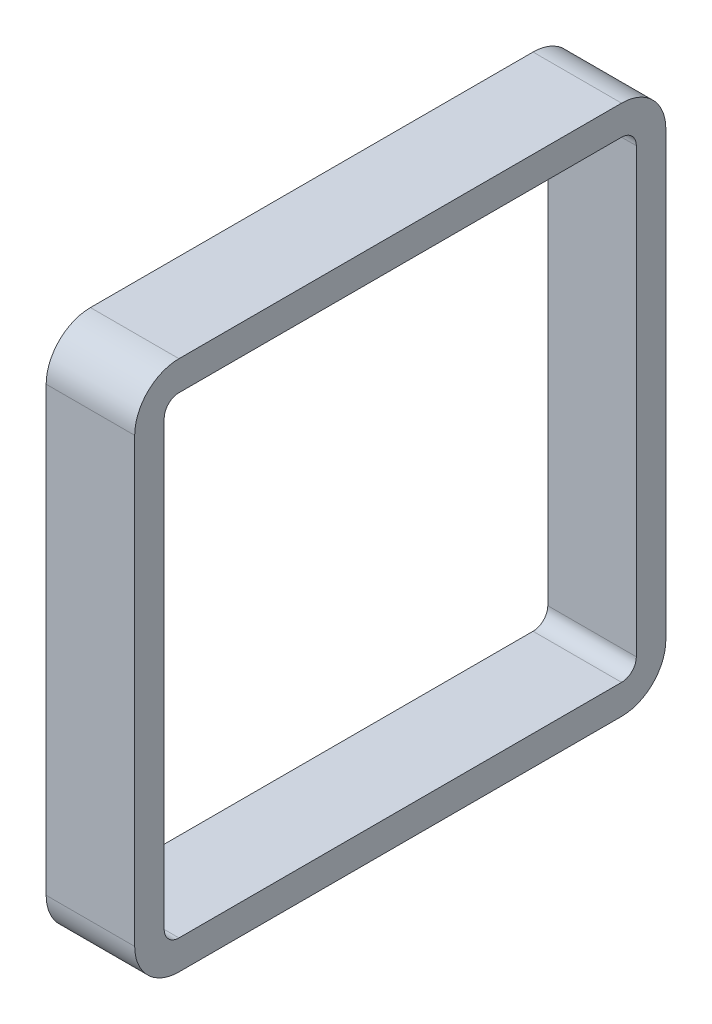
ISO-10303-21;
HEADER;
FILE_DESCRIPTION(('STEP AP214'),'2;1');
FILE_NAME('part.step','',(''),(''),'','','');
FILE_SCHEMA(('AUTOMOTIVE_DESIGN { 1 0 10303 214 1 1 1 1 }'));
ENDSEC;
DATA;
#1=APPLICATION_CONTEXT('core data for automotive mechanical design processes');
#2=APPLICATION_PROTOCOL_DEFINITION('international standard','automotive_design',2000,#1);
#3=PRODUCT_CONTEXT('',#1,'mechanical');
#4=PRODUCT('Part','Part','',(#3));
#5=PRODUCT_RELATED_PRODUCT_CATEGORY('part','',(#4));
#6=PRODUCT_DEFINITION_FORMATION('','',#4);
#7=PRODUCT_DEFINITION_CONTEXT('part definition',#1,'design');
#8=PRODUCT_DEFINITION('design','',#6,#7);
#9=PRODUCT_DEFINITION_SHAPE('','',#8);
#10=(LENGTH_UNIT() NAMED_UNIT(*) SI_UNIT(.MILLI.,.METRE.));
#11=(NAMED_UNIT(*) PLANE_ANGLE_UNIT() SI_UNIT($,.RADIAN.));
#12=(NAMED_UNIT(*) SI_UNIT($,.STERADIAN.) SOLID_ANGLE_UNIT());
#13=UNCERTAINTY_MEASURE_WITH_UNIT(LENGTH_MEASURE(1.E-05),#10,'distance_accuracy_value','');
#14=(GEOMETRIC_REPRESENTATION_CONTEXT(3) GLOBAL_UNCERTAINTY_ASSIGNED_CONTEXT((#13)) GLOBAL_UNIT_ASSIGNED_CONTEXT((#10,
#11,#12)) REPRESENTATION_CONTEXT('',''));
#15=CARTESIAN_POINT('',(0.,0.,0.));
#16=DIRECTION('',(0.,0.,1.));
#17=DIRECTION('',(1.,0.,0.));
#18=AXIS2_PLACEMENT_3D('',#15,#16,#17);
#19=CARTESIAN_POINT('',(-9.52500000000045,47.6249999999997,47.6249999999999));
#20=DIRECTION('',(1.,0.,0.));
#21=DIRECTION('',(0.,0.,-1.));
#22=AXIS2_PLACEMENT_3D('',#19,#20,#21);
#23=PLANE('',#22);
#24=DIRECTION('',(0.,1.,0.));
#25=VECTOR('',#24,1.);
#26=CARTESIAN_POINT('',(-9.52500000000034,47.6249999999997,50.8000000000001));
#27=LINE('',#26,#25);
#28=CARTESIAN_POINT('',(-9.52499999999978,-47.6250000000006,50.8000000000001));
#29=VERTEX_POINT('',#28);
#30=CARTESIAN_POINT('',(-9.52500000000034,47.6249999999997,50.8000000000001));
#31=VERTEX_POINT('',#30);
#32=EDGE_CURVE('E148',#29,#31,#27,.T.);
#33=ORIENTED_EDGE('',*,*,#32,.F.);
#34=CARTESIAN_POINT('',(-9.5249999999999,-47.6250000000004,47.6249999999999));
#35=DIRECTION('',(-1.,0.,0.));
#36=DIRECTION('',(0.,0.,1.));
#37=AXIS2_PLACEMENT_3D('',#34,#35,#36);
#38=CIRCLE('',#37,3.175);
#39=CARTESIAN_POINT('',(-9.5249999999999,-50.8000000000002,47.6249999999995));
#40=VERTEX_POINT('',#39);
#41=EDGE_CURVE('E194',#29,#40,#38,.F.);
#42=ORIENTED_EDGE('',*,*,#41,.T.);
#43=DIRECTION('',(0.,0.,1.));
#44=VECTOR('',#43,1.);
#45=CARTESIAN_POINT('',(-9.5249999999999,-50.8000000000002,47.6249999999995));
#46=LINE('',#45,#44);
#47=CARTESIAN_POINT('',(-9.5249999999999,-50.8000000000007,-47.6249999999998));
#48=VERTEX_POINT('',#47);
#49=EDGE_CURVE('E201',#48,#40,#46,.T.);
#50=ORIENTED_EDGE('',*,*,#49,.F.);
#51=CARTESIAN_POINT('',(-9.52500000000001,-47.6250000000004,-47.625));
#52=DIRECTION('',(-1.,0.,0.));
#53=DIRECTION('',(0.,0.,1.));
#54=AXIS2_PLACEMENT_3D('',#51,#52,#53);
#55=CIRCLE('',#54,3.175);
#56=CARTESIAN_POINT('',(-9.52500000000001,-47.6250000000004,-50.8000000000004));
#57=VERTEX_POINT('',#56);
#58=EDGE_CURVE('E198',#48,#57,#55,.F.);
#59=ORIENTED_EDGE('',*,*,#58,.T.);
#60=DIRECTION('',(0.,1.,0.));
#61=VECTOR('',#60,1.);
#62=CARTESIAN_POINT('',(-9.52500000000034,47.6249999999996,-50.8000000000006));
#63=LINE('',#62,#61);
#64=CARTESIAN_POINT('',(-9.52500000000034,47.6249999999996,-50.8000000000006));
#65=VERTEX_POINT('',#64);
#66=EDGE_CURVE('E206',#65,#57,#63,.F.);
#67=ORIENTED_EDGE('',*,*,#66,.F.);
#68=CARTESIAN_POINT('',(-9.52500000000045,47.625,-47.6250000000002));
#69=DIRECTION('',(-1.,0.,0.));
#70=DIRECTION('',(0.,0.,1.));
#71=AXIS2_PLACEMENT_3D('',#68,#69,#70);
#72=CIRCLE('',#71,3.175);
#73=CARTESIAN_POINT('',(-9.52500000000012,50.7999999999998,-47.6250000000002));
#74=VERTEX_POINT('',#73);
#75=EDGE_CURVE('E203',#65,#74,#72,.F.);
#76=ORIENTED_EDGE('',*,*,#75,.T.);
#77=DIRECTION('',(0.,0.,-1.));
#78=VECTOR('',#77,1.);
#79=CARTESIAN_POINT('',(-9.52500000000023,50.7999999999996,47.6249999999995));
#80=LINE('',#79,#78);
#81=CARTESIAN_POINT('',(-9.52500000000023,50.7999999999996,47.6249999999995));
#82=VERTEX_POINT('',#81);
#83=EDGE_CURVE('E154',#82,#74,#80,.T.);
#84=ORIENTED_EDGE('',*,*,#83,.F.);
#85=CARTESIAN_POINT('',(-9.52500000000045,47.6249999999997,47.6249999999999));
#86=DIRECTION('',(-1.,0.,0.));
#87=DIRECTION('',(0.,0.,1.));
#88=AXIS2_PLACEMENT_3D('',#85,#86,#87);
#89=CIRCLE('',#88,3.175);
#90=EDGE_CURVE('E208',#82,#31,#89,.F.);
#91=ORIENTED_EDGE('',*,*,#90,.T.);
#92=EDGE_LOOP('',(#33,#42,#50,#59,#67,#76,#84,#91));
#93=FACE_BOUND('',#92,.T.);
#94=DIRECTION('',(0.,0.,-1.));
#95=VECTOR('',#94,1.);
#96=CARTESIAN_POINT('',(-9.52499999999956,57.1499999999995,47.6249999999995));
#97=LINE('',#96,#95);
#98=CARTESIAN_POINT('',(-9.52499999999956,57.1499999999995,47.6249999999995));
#99=VERTEX_POINT('',#98);
#100=CARTESIAN_POINT('',(-9.5249999999999,57.1499999999997,-47.6250000000002));
#101=VERTEX_POINT('',#100);
#102=EDGE_CURVE('E130',#99,#101,#97,.T.);
#103=ORIENTED_EDGE('',*,*,#102,.T.);
#104=CARTESIAN_POINT('',(-9.52500000000045,47.625,-47.6250000000002));
#105=DIRECTION('',(-1.,0.,0.));
#106=DIRECTION('',(0.,0.,1.));
#107=AXIS2_PLACEMENT_3D('',#104,#105,#106);
#108=CIRCLE('',#107,9.52500000000001);
#109=CARTESIAN_POINT('',(-9.52500000000023,47.6249999999997,-57.15));
#110=VERTEX_POINT('',#109);
#111=EDGE_CURVE('E159',#110,#101,#108,.F.);
#112=ORIENTED_EDGE('',*,*,#111,.F.);
#113=DIRECTION('',(0.,1.,0.));
#114=VECTOR('',#113,1.);
#115=CARTESIAN_POINT('',(-9.52500000000023,47.6249999999997,-57.15));
#116=LINE('',#115,#114);
#117=CARTESIAN_POINT('',(-9.52500000000001,-47.6250000000004,-57.1500000000003));
#118=VERTEX_POINT('',#117);
#119=EDGE_CURVE('E156',#110,#118,#116,.F.);
#120=ORIENTED_EDGE('',*,*,#119,.T.);
#121=CARTESIAN_POINT('',(-9.52500000000001,-47.6250000000004,-47.625));
#122=DIRECTION('',(-1.,0.,0.));
#123=DIRECTION('',(0.,0.,1.));
#124=AXIS2_PLACEMENT_3D('',#121,#122,#123);
#125=CIRCLE('',#124,9.525);
#126=CARTESIAN_POINT('',(-9.52500000000023,-57.1500000000004,-47.6250000000002));
#127=VERTEX_POINT('',#126);
#128=EDGE_CURVE('E164',#127,#118,#125,.F.);
#129=ORIENTED_EDGE('',*,*,#128,.F.);
#130=DIRECTION('',(0.,0.,1.));
#131=VECTOR('',#130,1.);
#132=CARTESIAN_POINT('',(-9.52500000000023,-57.1500000000003,47.6249999999999));
#133=LINE('',#132,#131);
#134=CARTESIAN_POINT('',(-9.52500000000023,-57.1500000000003,47.6249999999999));
#135=VERTEX_POINT('',#134);
#136=EDGE_CURVE('E161',#127,#135,#133,.T.);
#137=ORIENTED_EDGE('',*,*,#136,.T.);
#138=CARTESIAN_POINT('',(-9.5249999999999,-47.6250000000004,47.6249999999999));
#139=DIRECTION('',(-1.,0.,0.));
#140=DIRECTION('',(0.,0.,1.));
#141=AXIS2_PLACEMENT_3D('',#138,#139,#140);
#142=CIRCLE('',#141,9.52500000000001);
#143=CARTESIAN_POINT('',(-9.52500000000001,-47.6250000000001,57.1499999999999));
#144=VERTEX_POINT('',#143);
#145=EDGE_CURVE('E166',#144,#135,#142,.F.);
#146=ORIENTED_EDGE('',*,*,#145,.F.);
#147=DIRECTION('',(0.,1.,0.));
#148=VECTOR('',#147,1.);
#149=CARTESIAN_POINT('',(-9.52500000000001,47.6249999999997,57.1499999999999));
#150=LINE('',#149,#148);
#151=CARTESIAN_POINT('',(-9.52500000000001,47.6249999999997,57.1499999999999));
#152=VERTEX_POINT('',#151);
#153=EDGE_CURVE('E133',#144,#152,#150,.T.);
#154=ORIENTED_EDGE('',*,*,#153,.T.);
#155=CARTESIAN_POINT('',(-9.52500000000045,47.6249999999997,47.6249999999999));
#156=DIRECTION('',(-1.,0.,0.));
#157=DIRECTION('',(0.,0.,1.));
#158=AXIS2_PLACEMENT_3D('',#155,#156,#157);
#159=CIRCLE('',#158,9.52500000000001);
#160=EDGE_CURVE('E20',#99,#152,#159,.F.);
#161=ORIENTED_EDGE('',*,*,#160,.F.);
#162=EDGE_LOOP('',(#103,#112,#120,#129,#137,#146,#154,#161));
#163=FACE_BOUND('',#162,.T.);
#164=ADVANCED_FACE('F17',(#93,#163),#23,.F.);
#165=CARTESIAN_POINT('',(9.52499999999956,47.6249999999999,47.6249999999999));
#166=DIRECTION('',(-1.,0.,0.));
#167=DIRECTION('',(0.,0.,1.));
#168=AXIS2_PLACEMENT_3D('',#165,#166,#167);
#169=CYLINDRICAL_SURFACE('',#168,9.52500000000001);
#170=CARTESIAN_POINT('',(9.52499999999956,47.6249999999999,47.6249999999999));
#171=DIRECTION('',(-1.,0.,0.));
#172=DIRECTION('',(0.,0.,1.));
#173=AXIS2_PLACEMENT_3D('',#170,#171,#172);
#174=CIRCLE('',#173,9.52500000000001);
#175=CARTESIAN_POINT('',(9.52500000000034,57.1500000000001,47.6249999999999));
#176=VERTEX_POINT('',#175);
#177=CARTESIAN_POINT('',(9.52499999999956,47.6250000000002,57.1499999999999));
#178=VERTEX_POINT('',#177);
#179=EDGE_CURVE('E141',#176,#178,#174,.F.);
#180=ORIENTED_EDGE('',*,*,#179,.F.);
#181=DIRECTION('',(1.,0.,0.));
#182=VECTOR('',#181,1.);
#183=CARTESIAN_POINT('',(9.52500000000034,57.1500000000001,47.6249999999999));
#184=LINE('',#183,#182);
#185=EDGE_CURVE('E138',#176,#99,#184,.F.);
#186=ORIENTED_EDGE('',*,*,#185,.T.);
#187=ORIENTED_EDGE('',*,*,#160,.T.);
#188=DIRECTION('',(1.,0.,0.));
#189=VECTOR('',#188,1.);
#190=CARTESIAN_POINT('',(9.52499999999956,47.6250000000002,57.1499999999999));
#191=LINE('',#190,#189);
#192=EDGE_CURVE('E136',#152,#178,#191,.T.);
#193=ORIENTED_EDGE('',*,*,#192,.T.);
#194=EDGE_LOOP('',(#180,#186,#187,#193));
#195=FACE_BOUND('',#194,.T.);
#196=ADVANCED_FACE('F139',(#195),#169,.T.);
#197=CARTESIAN_POINT('',(9.52499999999956,47.6250000000002,57.1499999999999));
#198=DIRECTION('',(0.,0.,-1.));
#199=DIRECTION('',(0.,1.,0.));
#200=AXIS2_PLACEMENT_3D('',#197,#198,#199);
#201=PLANE('',#200);
#202=DIRECTION('',(-1.,0.,0.));
#203=VECTOR('',#202,1.);
#204=CARTESIAN_POINT('',(9.52500000000001,-47.6250000000004,57.1499999999999));
#205=LINE('',#204,#203);
#206=CARTESIAN_POINT('',(9.52500000000001,-47.6250000000004,57.1499999999999));
#207=VERTEX_POINT('',#206);
#208=EDGE_CURVE('E214',#207,#144,#205,.T.);
#209=ORIENTED_EDGE('',*,*,#208,.F.);
#210=DIRECTION('',(0.,1.,0.));
#211=VECTOR('',#210,1.);
#212=CARTESIAN_POINT('',(9.52499999999956,47.6250000000002,57.1499999999999));
#213=LINE('',#212,#211);
#214=EDGE_CURVE('E192',#178,#207,#213,.F.);
#215=ORIENTED_EDGE('',*,*,#214,.F.);
#216=ORIENTED_EDGE('',*,*,#192,.F.);
#217=ORIENTED_EDGE('',*,*,#153,.F.);
#218=EDGE_LOOP('',(#209,#215,#216,#217));
#219=FACE_BOUND('',#218,.T.);
#220=ADVANCED_FACE('F438',(#219),#201,.F.);
#221=CARTESIAN_POINT('',(9.5249999999999,-47.6250000000001,47.6250000000004));
#222=DIRECTION('',(-1.,0.,0.));
#223=DIRECTION('',(0.,0.,1.));
#224=AXIS2_PLACEMENT_3D('',#221,#222,#223);
#225=CYLINDRICAL_SURFACE('',#224,9.52500000000001);
#226=CARTESIAN_POINT('',(9.5249999999999,-47.6250000000001,47.6250000000004));
#227=DIRECTION('',(-1.,0.,0.));
#228=DIRECTION('',(0.,0.,1.));
#229=AXIS2_PLACEMENT_3D('',#226,#227,#228);
#230=CIRCLE('',#229,9.52500000000001);
#231=CARTESIAN_POINT('',(9.52499999999956,-57.1499999999999,47.6249999999995));
#232=VERTEX_POINT('',#231);
#233=EDGE_CURVE('E189',#207,#232,#230,.F.);
#234=ORIENTED_EDGE('',*,*,#233,.F.);
#235=ORIENTED_EDGE('',*,*,#208,.T.);
#236=ORIENTED_EDGE('',*,*,#145,.T.);
#237=DIRECTION('',(1.,0.,0.));
#238=VECTOR('',#237,1.);
#239=CARTESIAN_POINT('',(9.52499999999956,-57.1499999999999,47.6249999999995));
#240=LINE('',#239,#238);
#241=EDGE_CURVE('E165',#135,#232,#240,.T.);
#242=ORIENTED_EDGE('',*,*,#241,.T.);
#243=EDGE_LOOP('',(#234,#235,#236,#242));
#244=FACE_BOUND('',#243,.T.);
#245=ADVANCED_FACE('F430',(#244),#225,.T.);
#246=CARTESIAN_POINT('',(9.52499999999956,-57.1499999999999,47.6249999999995));
#247=DIRECTION('',(0.,1.,0.));
#248=DIRECTION('',(0.,0.,1.));
#249=AXIS2_PLACEMENT_3D('',#246,#247,#248);
#250=PLANE('',#249);
#251=DIRECTION('',(-1.,0.,0.));
#252=VECTOR('',#251,1.);
#253=CARTESIAN_POINT('',(9.52499999999956,-57.15,-47.6250000000002));
#254=LINE('',#253,#252);
#255=CARTESIAN_POINT('',(9.52499999999956,-57.15,-47.6250000000002));
#256=VERTEX_POINT('',#255);
#257=EDGE_CURVE('E213',#256,#127,#254,.T.);
#258=ORIENTED_EDGE('',*,*,#257,.F.);
#259=DIRECTION('',(0.,0.,-1.));
#260=VECTOR('',#259,1.);
#261=CARTESIAN_POINT('',(9.52499999999956,-57.1499999999999,47.6249999999995));
#262=LINE('',#261,#260);
#263=EDGE_CURVE('E188',#232,#256,#262,.T.);
#264=ORIENTED_EDGE('',*,*,#263,.F.);
#265=ORIENTED_EDGE('',*,*,#241,.F.);
#266=ORIENTED_EDGE('',*,*,#136,.F.);
#267=EDGE_LOOP('',(#258,#264,#265,#266));
#268=FACE_BOUND('',#267,.T.);
#269=ADVANCED_FACE('F248',(#268),#250,.F.);
#270=CARTESIAN_POINT('',(9.52500000000012,-47.6249999999997,-47.6250000000002));
#271=DIRECTION('',(-1.,0.,0.));
#272=DIRECTION('',(0.,0.,1.));
#273=AXIS2_PLACEMENT_3D('',#270,#271,#272);
#274=CYLINDRICAL_SURFACE('',#273,9.525);
#275=CARTESIAN_POINT('',(9.52500000000012,-47.6249999999997,-47.6250000000002));
#276=DIRECTION('',(-1.,0.,0.));
#277=DIRECTION('',(0.,0.,1.));
#278=AXIS2_PLACEMENT_3D('',#275,#276,#277);
#279=CIRCLE('',#278,9.525);
#280=CARTESIAN_POINT('',(9.52500000000023,-47.6249999999999,-57.15));
#281=VERTEX_POINT('',#280);
#282=EDGE_CURVE('E185',#256,#281,#279,.F.);
#283=ORIENTED_EDGE('',*,*,#282,.F.);
#284=ORIENTED_EDGE('',*,*,#257,.T.);
#285=ORIENTED_EDGE('',*,*,#128,.T.);
#286=DIRECTION('',(1.,0.,0.));
#287=VECTOR('',#286,1.);
#288=CARTESIAN_POINT('',(9.52500000000023,-47.6249999999999,-57.15));
#289=LINE('',#288,#287);
#290=EDGE_CURVE('E160',#118,#281,#289,.T.);
#291=ORIENTED_EDGE('',*,*,#290,.T.);
#292=EDGE_LOOP('',(#283,#284,#285,#291));
#293=FACE_BOUND('',#292,.T.);
#294=ADVANCED_FACE('F243',(#293),#274,.T.);
#295=CARTESIAN_POINT('',(9.52499999999978,47.625,-57.1500000000005));
#296=DIRECTION('',(0.,0.,1.));
#297=DIRECTION('',(1.,0.,0.));
#298=AXIS2_PLACEMENT_3D('',#295,#296,#297);
#299=PLANE('',#298);
#300=DIRECTION('',(-1.,0.,0.));
#301=VECTOR('',#300,1.);
#302=CARTESIAN_POINT('',(9.52499999999978,47.625,-57.1500000000005));
#303=LINE('',#302,#301);
#304=CARTESIAN_POINT('',(9.52499999999978,47.625,-57.1500000000005));
#305=VERTEX_POINT('',#304);
#306=EDGE_CURVE('E212',#305,#110,#303,.T.);
#307=ORIENTED_EDGE('',*,*,#306,.F.);
#308=DIRECTION('',(0.,1.,0.));
#309=VECTOR('',#308,1.);
#310=CARTESIAN_POINT('',(9.52499999999978,47.625,-57.1500000000005));
#311=LINE('',#310,#309);
#312=EDGE_CURVE('E184',#281,#305,#311,.T.);
#313=ORIENTED_EDGE('',*,*,#312,.F.);
#314=ORIENTED_EDGE('',*,*,#290,.F.);
#315=ORIENTED_EDGE('',*,*,#119,.F.);
#316=EDGE_LOOP('',(#307,#313,#314,#315));
#317=FACE_BOUND('',#316,.T.);
#318=ADVANCED_FACE('F254',(#317),#299,.F.);
#319=CARTESIAN_POINT('',(9.52499999999956,47.625,-47.6250000000005));
#320=DIRECTION('',(-1.,0.,0.));
#321=DIRECTION('',(0.,0.,1.));
#322=AXIS2_PLACEMENT_3D('',#319,#320,#321);
#323=CYLINDRICAL_SURFACE('',#322,9.52500000000001);
#324=CARTESIAN_POINT('',(9.52499999999956,47.625,-47.6250000000005));
#325=DIRECTION('',(-1.,0.,0.));
#326=DIRECTION('',(0.,0.,1.));
#327=AXIS2_PLACEMENT_3D('',#324,#325,#326);
#328=CIRCLE('',#327,9.52500000000001);
#329=CARTESIAN_POINT('',(9.52500000000012,57.1500000000001,-47.6250000000007));
#330=VERTEX_POINT('',#329);
#331=EDGE_CURVE('E180',#305,#330,#328,.F.);
#332=ORIENTED_EDGE('',*,*,#331,.F.);
#333=ORIENTED_EDGE('',*,*,#306,.T.);
#334=ORIENTED_EDGE('',*,*,#111,.T.);
#335=DIRECTION('',(1.,0.,0.));
#336=VECTOR('',#335,1.);
#337=CARTESIAN_POINT('',(9.52500000000012,57.1500000000001,-47.6250000000007));
#338=LINE('',#337,#336);
#339=EDGE_CURVE('E145',#101,#330,#338,.T.);
#340=ORIENTED_EDGE('',*,*,#339,.T.);
#341=EDGE_LOOP('',(#332,#333,#334,#340));
#342=FACE_BOUND('',#341,.T.);
#343=ADVANCED_FACE('F290',(#342),#323,.T.);
#344=CARTESIAN_POINT('',(9.52500000000034,57.1500000000001,47.6249999999999));
#345=DIRECTION('',(0.,-1.,0.));
#346=DIRECTION('',(0.,0.,-1.));
#347=AXIS2_PLACEMENT_3D('',#344,#345,#346);
#348=PLANE('',#347);
#349=ORIENTED_EDGE('',*,*,#185,.F.);
#350=DIRECTION('',(0.,0.,-1.));
#351=VECTOR('',#350,1.);
#352=CARTESIAN_POINT('',(9.52500000000034,57.1500000000001,47.6249999999999));
#353=LINE('',#352,#351);
#354=EDGE_CURVE('E183',#330,#176,#353,.F.);
#355=ORIENTED_EDGE('',*,*,#354,.F.);
#356=ORIENTED_EDGE('',*,*,#339,.F.);
#357=ORIENTED_EDGE('',*,*,#102,.F.);
#358=EDGE_LOOP('',(#349,#355,#356,#357));
#359=FACE_BOUND('',#358,.T.);
#360=ADVANCED_FACE('F147',(#359),#348,.F.);
#361=CARTESIAN_POINT('',(9.52499999999967,47.6249999999998,50.8000000000001));
#362=DIRECTION('',(0.,0.,-1.));
#363=DIRECTION('',(0.,1.,0.));
#364=AXIS2_PLACEMENT_3D('',#361,#362,#363);
#365=PLANE('',#364);
#366=DIRECTION('',(0.,1.,0.));
#367=VECTOR('',#366,1.);
#368=CARTESIAN_POINT('',(9.52499999999967,47.6249999999998,50.8000000000001));
#369=LINE('',#368,#367);
#370=CARTESIAN_POINT('',(9.52500000000001,-47.6250000000001,50.8000000000001));
#371=VERTEX_POINT('',#370);
#372=CARTESIAN_POINT('',(9.52499999999967,47.6249999999998,50.8000000000001));
#373=VERTEX_POINT('',#372);
#374=EDGE_CURVE('E179',#371,#373,#369,.T.);
#375=ORIENTED_EDGE('',*,*,#374,.F.);
#376=DIRECTION('',(-1.,0.,0.));
#377=VECTOR('',#376,1.);
#378=CARTESIAN_POINT('',(9.52500000000001,-47.6250000000001,50.8000000000001));
#379=LINE('',#378,#377);
#380=EDGE_CURVE('E197',#371,#29,#379,.T.);
#381=ORIENTED_EDGE('',*,*,#380,.T.);
#382=ORIENTED_EDGE('',*,*,#32,.T.);
#383=DIRECTION('',(-1.,0.,0.));
#384=VECTOR('',#383,1.);
#385=CARTESIAN_POINT('',(9.52499999999967,47.6249999999998,50.8000000000001));
#386=LINE('',#385,#384);
#387=EDGE_CURVE('E150',#31,#373,#386,.F.);
#388=ORIENTED_EDGE('',*,*,#387,.T.);
#389=EDGE_LOOP('',(#375,#381,#382,#388));
#390=FACE_BOUND('',#389,.T.);
#391=ADVANCED_FACE('F298',(#390),#365,.T.);
#392=CARTESIAN_POINT('',(9.52499999999956,47.6249999999999,47.6249999999999));
#393=DIRECTION('',(-1.,0.,0.));
#394=DIRECTION('',(0.,0.,1.));
#395=AXIS2_PLACEMENT_3D('',#392,#393,#394);
#396=CYLINDRICAL_SURFACE('',#395,3.175);
#397=DIRECTION('',(1.,0.,0.));
#398=VECTOR('',#397,1.);
#399=CARTESIAN_POINT('',(9.5249999999999,50.7999999999997,47.6249999999999));
#400=LINE('',#399,#398);
#401=CARTESIAN_POINT('',(9.5249999999999,50.7999999999997,47.6249999999999));
#402=VERTEX_POINT('',#401);
#403=EDGE_CURVE('E233',#402,#82,#400,.F.);
#404=ORIENTED_EDGE('',*,*,#403,.F.);
#405=CARTESIAN_POINT('',(9.52499999999956,47.6249999999999,47.6249999999999));
#406=DIRECTION('',(-1.,0.,0.));
#407=DIRECTION('',(0.,0.,1.));
#408=AXIS2_PLACEMENT_3D('',#405,#406,#407);
#409=CIRCLE('',#408,3.175);
#410=EDGE_CURVE('E176',#373,#402,#409,.T.);
#411=ORIENTED_EDGE('',*,*,#410,.F.);
#412=ORIENTED_EDGE('',*,*,#387,.F.);
#413=ORIENTED_EDGE('',*,*,#90,.F.);
#414=EDGE_LOOP('',(#404,#411,#412,#413));
#415=FACE_BOUND('',#414,.T.);
#416=ADVANCED_FACE('F322',(#415),#396,.F.);
#417=CARTESIAN_POINT('',(9.5249999999999,50.7999999999997,47.6249999999999));
#418=DIRECTION('',(0.,-1.,0.));
#419=DIRECTION('',(0.,0.,-1.));
#420=AXIS2_PLACEMENT_3D('',#417,#418,#419);
#421=PLANE('',#420);
#422=DIRECTION('',(0.,0.,-1.));
#423=VECTOR('',#422,1.);
#424=CARTESIAN_POINT('',(9.5249999999999,50.7999999999997,47.6249999999999));
#425=LINE('',#424,#423);
#426=CARTESIAN_POINT('',(9.52499999999956,50.7999999999996,-47.6249999999998));
#427=VERTEX_POINT('',#426);
#428=EDGE_CURVE('E175',#402,#427,#425,.T.);
#429=ORIENTED_EDGE('',*,*,#428,.F.);
#430=ORIENTED_EDGE('',*,*,#403,.T.);
#431=ORIENTED_EDGE('',*,*,#83,.T.);
#432=DIRECTION('',(-1.,0.,0.));
#433=VECTOR('',#432,1.);
#434=CARTESIAN_POINT('',(9.52499999999956,50.7999999999996,-47.6249999999998));
#435=LINE('',#434,#433);
#436=EDGE_CURVE('E207',#74,#427,#435,.F.);
#437=ORIENTED_EDGE('',*,*,#436,.T.);
#438=EDGE_LOOP('',(#429,#430,#431,#437));
#439=FACE_BOUND('',#438,.T.);
#440=ADVANCED_FACE('F318',(#439),#421,.T.);
#441=CARTESIAN_POINT('',(9.52499999999956,47.625,-47.6250000000005));
#442=DIRECTION('',(-1.,0.,0.));
#443=DIRECTION('',(0.,0.,1.));
#444=AXIS2_PLACEMENT_3D('',#441,#442,#443);
#445=CYLINDRICAL_SURFACE('',#444,3.175);
#446=DIRECTION('',(1.,0.,0.));
#447=VECTOR('',#446,1.);
#448=CARTESIAN_POINT('',(9.5249999999999,47.6249999999998,-50.8000000000002));
#449=LINE('',#448,#447);
#450=CARTESIAN_POINT('',(9.5249999999999,47.6249999999998,-50.8000000000002));
#451=VERTEX_POINT('',#450);
#452=EDGE_CURVE('E224',#451,#65,#449,.F.);
#453=ORIENTED_EDGE('',*,*,#452,.F.);
#454=CARTESIAN_POINT('',(9.52499999999956,47.625,-47.6250000000005));
#455=DIRECTION('',(-1.,0.,0.));
#456=DIRECTION('',(0.,0.,1.));
#457=AXIS2_PLACEMENT_3D('',#454,#455,#456);
#458=CIRCLE('',#457,3.175);
#459=EDGE_CURVE('E172',#427,#451,#458,.T.);
#460=ORIENTED_EDGE('',*,*,#459,.F.);
#461=ORIENTED_EDGE('',*,*,#436,.F.);
#462=ORIENTED_EDGE('',*,*,#75,.F.);
#463=EDGE_LOOP('',(#453,#460,#461,#462));
#464=FACE_BOUND('',#463,.T.);
#465=ADVANCED_FACE('F315',(#464),#445,.F.);
#466=CARTESIAN_POINT('',(9.5249999999999,47.6249999999998,-50.8000000000002));
#467=DIRECTION('',(0.,0.,1.));
#468=DIRECTION('',(1.,0.,0.));
#469=AXIS2_PLACEMENT_3D('',#466,#467,#468);
#470=PLANE('',#469);
#471=DIRECTION('',(0.,1.,0.));
#472=VECTOR('',#471,1.);
#473=CARTESIAN_POINT('',(9.5249999999999,47.6249999999998,-50.8000000000002));
#474=LINE('',#473,#472);
#475=CARTESIAN_POINT('',(9.52500000000023,-47.6249999999997,-50.8000000000002));
#476=VERTEX_POINT('',#475);
#477=EDGE_CURVE('E171',#451,#476,#474,.F.);
#478=ORIENTED_EDGE('',*,*,#477,.F.);
#479=ORIENTED_EDGE('',*,*,#452,.T.);
#480=ORIENTED_EDGE('',*,*,#66,.T.);
#481=DIRECTION('',(-1.,0.,0.));
#482=VECTOR('',#481,1.);
#483=CARTESIAN_POINT('',(9.52500000000023,-47.6249999999997,-50.8000000000002));
#484=LINE('',#483,#482);
#485=EDGE_CURVE('E202',#57,#476,#484,.F.);
#486=ORIENTED_EDGE('',*,*,#485,.T.);
#487=EDGE_LOOP('',(#478,#479,#480,#486));
#488=FACE_BOUND('',#487,.T.);
#489=ADVANCED_FACE('F312',(#488),#470,.T.);
#490=CARTESIAN_POINT('',(9.52500000000012,-47.6249999999997,-47.6250000000002));
#491=DIRECTION('',(-1.,0.,0.));
#492=DIRECTION('',(0.,0.,1.));
#493=AXIS2_PLACEMENT_3D('',#490,#491,#492);
#494=CYLINDRICAL_SURFACE('',#493,3.175);
#495=DIRECTION('',(1.,0.,0.));
#496=VECTOR('',#495,1.);
#497=CARTESIAN_POINT('',(9.52500000000001,-50.7999999999996,-47.625));
#498=LINE('',#497,#496);
#499=CARTESIAN_POINT('',(9.52500000000001,-50.7999999999996,-47.625));
#500=VERTEX_POINT('',#499);
#501=EDGE_CURVE('E223',#500,#48,#498,.F.);
#502=ORIENTED_EDGE('',*,*,#501,.F.);
#503=CARTESIAN_POINT('',(9.52500000000012,-47.6249999999997,-47.6250000000002));
#504=DIRECTION('',(-1.,0.,0.));
#505=DIRECTION('',(0.,0.,1.));
#506=AXIS2_PLACEMENT_3D('',#503,#504,#505);
#507=CIRCLE('',#506,3.175);
#508=EDGE_CURVE('E168',#476,#500,#507,.T.);
#509=ORIENTED_EDGE('',*,*,#508,.F.);
#510=ORIENTED_EDGE('',*,*,#485,.F.);
#511=ORIENTED_EDGE('',*,*,#58,.F.);
#512=EDGE_LOOP('',(#502,#509,#510,#511));
#513=FACE_BOUND('',#512,.T.);
#514=ADVANCED_FACE('F273',(#513),#494,.F.);
#515=CARTESIAN_POINT('',(9.52500000000001,-50.7999999999998,47.6249999999999));
#516=DIRECTION('',(0.,1.,0.));
#517=DIRECTION('',(0.,0.,1.));
#518=AXIS2_PLACEMENT_3D('',#515,#516,#517);
#519=PLANE('',#518);
#520=DIRECTION('',(0.,0.,-1.));
#521=VECTOR('',#520,1.);
#522=CARTESIAN_POINT('',(9.52500000000001,-50.7999999999998,47.6249999999999));
#523=LINE('',#522,#521);
#524=CARTESIAN_POINT('',(9.52500000000001,-50.7999999999998,47.6249999999999));
#525=VERTEX_POINT('',#524);
#526=EDGE_CURVE('E26',#500,#525,#523,.F.);
#527=ORIENTED_EDGE('',*,*,#526,.F.);
#528=ORIENTED_EDGE('',*,*,#501,.T.);
#529=ORIENTED_EDGE('',*,*,#49,.T.);
#530=DIRECTION('',(-1.,0.,0.));
#531=VECTOR('',#530,1.);
#532=CARTESIAN_POINT('',(9.52500000000001,-50.7999999999998,47.6249999999999));
#533=LINE('',#532,#531);
#534=EDGE_CURVE('E35',#40,#525,#533,.F.);
#535=ORIENTED_EDGE('',*,*,#534,.T.);
#536=EDGE_LOOP('',(#527,#528,#529,#535));
#537=FACE_BOUND('',#536,.T.);
#538=ADVANCED_FACE('F268',(#537),#519,.T.);
#539=CARTESIAN_POINT('',(9.5249999999999,-47.6250000000001,47.6250000000004));
#540=DIRECTION('',(-1.,0.,0.));
#541=DIRECTION('',(0.,0.,1.));
#542=AXIS2_PLACEMENT_3D('',#539,#540,#541);
#543=CYLINDRICAL_SURFACE('',#542,3.175);
#544=ORIENTED_EDGE('',*,*,#380,.F.);
#545=CARTESIAN_POINT('',(9.5249999999999,-47.6250000000001,47.6250000000004));
#546=DIRECTION('',(-1.,0.,0.));
#547=DIRECTION('',(0.,0.,1.));
#548=AXIS2_PLACEMENT_3D('',#545,#546,#547);
#549=CIRCLE('',#548,3.175);
#550=EDGE_CURVE('E11',#525,#371,#549,.T.);
#551=ORIENTED_EDGE('',*,*,#550,.F.);
#552=ORIENTED_EDGE('',*,*,#534,.F.);
#553=ORIENTED_EDGE('',*,*,#41,.F.);
#554=EDGE_LOOP('',(#544,#551,#552,#553));
#555=FACE_BOUND('',#554,.T.);
#556=ADVANCED_FACE('F281',(#555),#543,.F.);
#557=CARTESIAN_POINT('',(9.52499999999956,47.6249999999999,47.6249999999999));
#558=DIRECTION('',(1.,0.,0.));
#559=DIRECTION('',(0.,0.,-1.));
#560=AXIS2_PLACEMENT_3D('',#557,#558,#559);
#561=PLANE('',#560);
#562=ORIENTED_EDGE('',*,*,#526,.T.);
#563=ORIENTED_EDGE('',*,*,#550,.T.);
#564=ORIENTED_EDGE('',*,*,#374,.T.);
#565=ORIENTED_EDGE('',*,*,#410,.T.);
#566=ORIENTED_EDGE('',*,*,#428,.T.);
#567=ORIENTED_EDGE('',*,*,#459,.T.);
#568=ORIENTED_EDGE('',*,*,#477,.T.);
#569=ORIENTED_EDGE('',*,*,#508,.T.);
#570=EDGE_LOOP('',(#562,#563,#564,#565,#566,#567,#568,#569));
#571=FACE_BOUND('',#570,.T.);
#572=ORIENTED_EDGE('',*,*,#331,.T.);
#573=ORIENTED_EDGE('',*,*,#354,.T.);
#574=ORIENTED_EDGE('',*,*,#179,.T.);
#575=ORIENTED_EDGE('',*,*,#214,.T.);
#576=ORIENTED_EDGE('',*,*,#233,.T.);
#577=ORIENTED_EDGE('',*,*,#263,.T.);
#578=ORIENTED_EDGE('',*,*,#282,.T.);
#579=ORIENTED_EDGE('',*,*,#312,.T.);
#580=EDGE_LOOP('',(#572,#573,#574,#575,#576,#577,#578,#579));
#581=FACE_BOUND('',#580,.T.);
#582=ADVANCED_FACE('F259',(#571,#581),#561,.T.);
#583=CLOSED_SHELL('',(#164,#196,#220,#245,#269,#294,#318,#343,#360,#391,#416,#440,#465,#489,
#514,#538,#556,#582));
#584=MANIFOLD_SOLID_BREP('B1',#583);
#585=ADVANCED_BREP_SHAPE_REPRESENTATION('',(#18,#584),#14);
#586=SHAPE_DEFINITION_REPRESENTATION(#9,#585);
ENDSEC;
END-ISO-10303-21;
